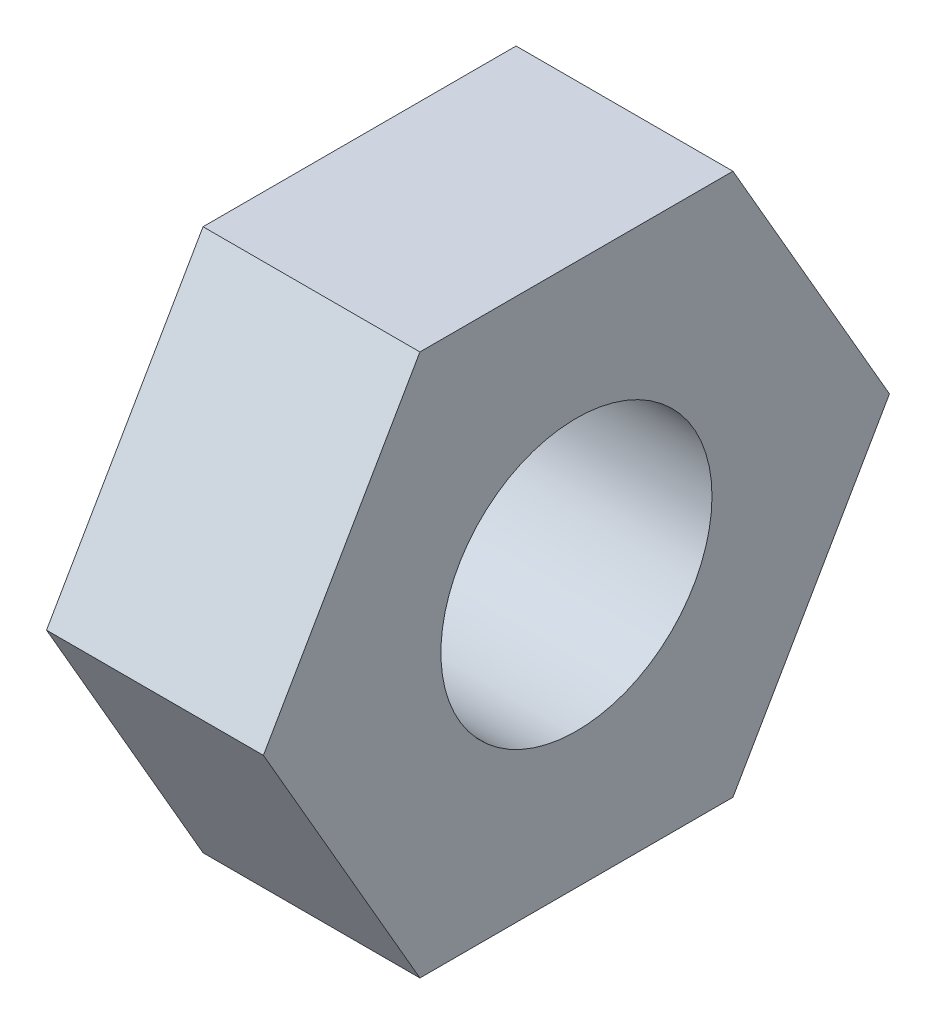
ISO-10303-21;
HEADER;
FILE_DESCRIPTION(('STEP AP214'),'2;1');
FILE_NAME('part.step','',(''),(''),'','','');
FILE_SCHEMA(('AUTOMOTIVE_DESIGN { 1 0 10303 214 1 1 1 1 }'));
ENDSEC;
DATA;
#1=APPLICATION_CONTEXT('core data for automotive mechanical design processes');
#2=APPLICATION_PROTOCOL_DEFINITION('international standard','automotive_design',2000,#1);
#3=PRODUCT_CONTEXT('',#1,'mechanical');
#4=PRODUCT('Part','Part','',(#3));
#5=PRODUCT_RELATED_PRODUCT_CATEGORY('part','',(#4));
#6=PRODUCT_DEFINITION_FORMATION('','',#4);
#7=PRODUCT_DEFINITION_CONTEXT('part definition',#1,'design');
#8=PRODUCT_DEFINITION('design','',#6,#7);
#9=PRODUCT_DEFINITION_SHAPE('','',#8);
#10=(LENGTH_UNIT() NAMED_UNIT(*) SI_UNIT(.MILLI.,.METRE.));
#11=(NAMED_UNIT(*) PLANE_ANGLE_UNIT() SI_UNIT($,.RADIAN.));
#12=(NAMED_UNIT(*) SI_UNIT($,.STERADIAN.) SOLID_ANGLE_UNIT());
#13=UNCERTAINTY_MEASURE_WITH_UNIT(LENGTH_MEASURE(1.E-05),#10,'distance_accuracy_value','');
#14=(GEOMETRIC_REPRESENTATION_CONTEXT(3) GLOBAL_UNCERTAINTY_ASSIGNED_CONTEXT((#13)) GLOBAL_UNIT_ASSIGNED_CONTEXT((#10,
#11,#12)) REPRESENTATION_CONTEXT('',''));
#15=CARTESIAN_POINT('',(0.,0.,0.));
#16=DIRECTION('',(0.,0.,1.));
#17=DIRECTION('',(1.,0.,0.));
#18=AXIS2_PLACEMENT_3D('',#15,#16,#17);
#19=CARTESIAN_POINT('',(1.6,-2.,-1.15470053837925));
#20=DIRECTION('',(0.,0.5,0.866025403784439));
#21=DIRECTION('',(0.,-0.866025403784439,0.5));
#22=AXIS2_PLACEMENT_3D('',#19,#20,#21);
#23=PLANE('',#22);
#24=DIRECTION('',(0.,0.866025403784439,-0.5));
#25=VECTOR('',#24,1.);
#26=CARTESIAN_POINT('',(0.,-2.,-1.15470053837925));
#27=LINE('',#26,#25);
#28=CARTESIAN_POINT('',(0.,-2.,-1.15470053837925));
#29=VERTEX_POINT('',#28);
#30=CARTESIAN_POINT('',(0.,0.,-2.3094010767585));
#31=VERTEX_POINT('',#30);
#32=EDGE_CURVE('E127',#29,#31,#27,.T.);
#33=ORIENTED_EDGE('',*,*,#32,.T.);
#34=DIRECTION('',(-1.,0.,0.));
#35=VECTOR('',#34,1.);
#36=CARTESIAN_POINT('',(1.6,0.,-2.3094010767585));
#37=LINE('',#36,#35);
#38=CARTESIAN_POINT('',(1.6,0.,-2.3094010767585));
#39=VERTEX_POINT('',#38);
#40=EDGE_CURVE('E11',#39,#31,#37,.T.);
#41=ORIENTED_EDGE('',*,*,#40,.F.);
#42=DIRECTION('',(0.,0.866025403784439,-0.5));
#43=VECTOR('',#42,1.);
#44=CARTESIAN_POINT('',(1.6,-2.,-1.15470053837925));
#45=LINE('',#44,#43);
#46=CARTESIAN_POINT('',(1.6,-2.,-1.15470053837925));
#47=VERTEX_POINT('',#46);
#48=EDGE_CURVE('E139',#47,#39,#45,.T.);
#49=ORIENTED_EDGE('',*,*,#48,.F.);
#50=DIRECTION('',(-1.,0.,0.));
#51=VECTOR('',#50,1.);
#52=CARTESIAN_POINT('',(1.6,-2.,-1.15470053837925));
#53=LINE('',#52,#51);
#54=EDGE_CURVE('E124',#47,#29,#53,.T.);
#55=ORIENTED_EDGE('',*,*,#54,.T.);
#56=EDGE_LOOP('',(#33,#41,#49,#55));
#57=FACE_BOUND('',#56,.T.);
#58=ADVANCED_FACE('F41',(#57),#23,.F.);
#59=CARTESIAN_POINT('',(1.6,0.,-2.3094010767585));
#60=DIRECTION('',(0.,-0.5,0.866025403784439));
#61=DIRECTION('',(0.,-0.866025403784439,-0.5));
#62=AXIS2_PLACEMENT_3D('',#59,#60,#61);
#63=PLANE('',#62);
#64=DIRECTION('',(0.,0.866025403784439,0.5));
#65=VECTOR('',#64,1.);
#66=CARTESIAN_POINT('',(0.,0.,-2.3094010767585));
#67=LINE('',#66,#65);
#68=CARTESIAN_POINT('',(0.,2.,-1.15470053837925));
#69=VERTEX_POINT('',#68);
#70=EDGE_CURVE('E129',#31,#69,#67,.T.);
#71=ORIENTED_EDGE('',*,*,#70,.T.);
#72=DIRECTION('',(-1.,0.,0.));
#73=VECTOR('',#72,1.);
#74=CARTESIAN_POINT('',(1.6,2.,-1.15470053837925));
#75=LINE('',#74,#73);
#76=CARTESIAN_POINT('',(1.6,2.,-1.15470053837925));
#77=VERTEX_POINT('',#76);
#78=EDGE_CURVE('E49',#77,#69,#75,.T.);
#79=ORIENTED_EDGE('',*,*,#78,.F.);
#80=DIRECTION('',(0.,0.866025403784439,0.5));
#81=VECTOR('',#80,1.);
#82=CARTESIAN_POINT('',(1.6,0.,-2.3094010767585));
#83=LINE('',#82,#81);
#84=EDGE_CURVE('E92',#39,#77,#83,.T.);
#85=ORIENTED_EDGE('',*,*,#84,.F.);
#86=ORIENTED_EDGE('',*,*,#40,.T.);
#87=EDGE_LOOP('',(#71,#79,#85,#86));
#88=FACE_BOUND('',#87,.T.);
#89=ADVANCED_FACE('F162',(#88),#63,.F.);
#90=CARTESIAN_POINT('',(1.6,2.,-1.15470053837925));
#91=DIRECTION('',(0.,-1.,0.));
#92=DIRECTION('',(0.,0.,-1.));
#93=AXIS2_PLACEMENT_3D('',#90,#91,#92);
#94=PLANE('',#93);
#95=DIRECTION('',(0.,0.,1.));
#96=VECTOR('',#95,1.);
#97=CARTESIAN_POINT('',(0.,2.,-1.15470053837925));
#98=LINE('',#97,#96);
#99=CARTESIAN_POINT('',(0.,2.,1.15470053837925));
#100=VERTEX_POINT('',#99);
#101=EDGE_CURVE('E131',#69,#100,#98,.T.);
#102=ORIENTED_EDGE('',*,*,#101,.T.);
#103=DIRECTION('',(-1.,0.,0.));
#104=VECTOR('',#103,1.);
#105=CARTESIAN_POINT('',(1.6,2.,1.15470053837925));
#106=LINE('',#105,#104);
#107=CARTESIAN_POINT('',(1.6,2.,1.15470053837925));
#108=VERTEX_POINT('',#107);
#109=EDGE_CURVE('E116',#108,#100,#106,.T.);
#110=ORIENTED_EDGE('',*,*,#109,.F.);
#111=DIRECTION('',(0.,0.,1.));
#112=VECTOR('',#111,1.);
#113=CARTESIAN_POINT('',(1.6,2.,-1.15470053837925));
#114=LINE('',#113,#112);
#115=EDGE_CURVE('E107',#77,#108,#114,.T.);
#116=ORIENTED_EDGE('',*,*,#115,.F.);
#117=ORIENTED_EDGE('',*,*,#78,.T.);
#118=EDGE_LOOP('',(#102,#110,#116,#117));
#119=FACE_BOUND('',#118,.T.);
#120=ADVANCED_FACE('F145',(#119),#94,.F.);
#121=CARTESIAN_POINT('',(1.6,2.,1.15470053837925));
#122=DIRECTION('',(0.,-0.5,-0.866025403784438));
#123=DIRECTION('',(0.,0.866025403784439,-0.5));
#124=AXIS2_PLACEMENT_3D('',#121,#122,#123);
#125=PLANE('',#124);
#126=DIRECTION('',(0.,-0.866025403784438,0.5));
#127=VECTOR('',#126,1.);
#128=CARTESIAN_POINT('',(0.,2.,1.15470053837925));
#129=LINE('',#128,#127);
#130=CARTESIAN_POINT('',(0.,0.,2.3094010767585));
#131=VERTEX_POINT('',#130);
#132=EDGE_CURVE('E119',#100,#131,#129,.T.);
#133=ORIENTED_EDGE('',*,*,#132,.T.);
#134=DIRECTION('',(-1.,0.,0.));
#135=VECTOR('',#134,1.);
#136=CARTESIAN_POINT('',(1.6,0.,2.3094010767585));
#137=LINE('',#136,#135);
#138=CARTESIAN_POINT('',(1.6,0.,2.3094010767585));
#139=VERTEX_POINT('',#138);
#140=EDGE_CURVE('E114',#139,#131,#137,.T.);
#141=ORIENTED_EDGE('',*,*,#140,.F.);
#142=DIRECTION('',(0.,-0.866025403784438,0.5));
#143=VECTOR('',#142,1.);
#144=CARTESIAN_POINT('',(1.6,2.,1.15470053837925));
#145=LINE('',#144,#143);
#146=EDGE_CURVE('E105',#108,#139,#145,.T.);
#147=ORIENTED_EDGE('',*,*,#146,.F.);
#148=ORIENTED_EDGE('',*,*,#109,.T.);
#149=EDGE_LOOP('',(#133,#141,#147,#148));
#150=FACE_BOUND('',#149,.T.);
#151=ADVANCED_FACE('F111',(#150),#125,.F.);
#152=CARTESIAN_POINT('',(1.6,0.,2.3094010767585));
#153=DIRECTION('',(0.,0.5,-0.866025403784439));
#154=DIRECTION('',(0.,0.866025403784439,0.5));
#155=AXIS2_PLACEMENT_3D('',#152,#153,#154);
#156=PLANE('',#155);
#157=DIRECTION('',(0.,-0.866025403784439,-0.5));
#158=VECTOR('',#157,1.);
#159=CARTESIAN_POINT('',(0.,0.,2.3094010767585));
#160=LINE('',#159,#158);
#161=CARTESIAN_POINT('',(0.,-2.,1.15470053837925));
#162=VERTEX_POINT('',#161);
#163=EDGE_CURVE('E83',#131,#162,#160,.T.);
#164=ORIENTED_EDGE('',*,*,#163,.T.);
#165=DIRECTION('',(-1.,0.,0.));
#166=VECTOR('',#165,1.);
#167=CARTESIAN_POINT('',(1.6,-2.,1.15470053837925));
#168=LINE('',#167,#166);
#169=CARTESIAN_POINT('',(1.6,-2.,1.15470053837925));
#170=VERTEX_POINT('',#169);
#171=EDGE_CURVE('E120',#170,#162,#168,.T.);
#172=ORIENTED_EDGE('',*,*,#171,.F.);
#173=DIRECTION('',(0.,-0.866025403784439,-0.5));
#174=VECTOR('',#173,1.);
#175=CARTESIAN_POINT('',(1.6,0.,2.3094010767585));
#176=LINE('',#175,#174);
#177=EDGE_CURVE('E106',#139,#170,#176,.T.);
#178=ORIENTED_EDGE('',*,*,#177,.F.);
#179=ORIENTED_EDGE('',*,*,#140,.T.);
#180=EDGE_LOOP('',(#164,#172,#178,#179));
#181=FACE_BOUND('',#180,.T.);
#182=ADVANCED_FACE('F117',(#181),#156,.F.);
#183=CARTESIAN_POINT('',(1.6,-2.,1.15470053837925));
#184=DIRECTION('',(0.,1.,0.));
#185=DIRECTION('',(0.,0.,1.));
#186=AXIS2_PLACEMENT_3D('',#183,#184,#185);
#187=PLANE('',#186);
#188=DIRECTION('',(0.,0.,-1.));
#189=VECTOR('',#188,1.);
#190=CARTESIAN_POINT('',(0.,-2.,1.15470053837925));
#191=LINE('',#190,#189);
#192=EDGE_CURVE('E87',#162,#29,#191,.T.);
#193=ORIENTED_EDGE('',*,*,#192,.T.);
#194=ORIENTED_EDGE('',*,*,#54,.F.);
#195=DIRECTION('',(0.,0.,-1.));
#196=VECTOR('',#195,1.);
#197=CARTESIAN_POINT('',(1.6,-2.,1.15470053837925));
#198=LINE('',#197,#196);
#199=EDGE_CURVE('E59',#170,#47,#198,.T.);
#200=ORIENTED_EDGE('',*,*,#199,.F.);
#201=ORIENTED_EDGE('',*,*,#171,.T.);
#202=EDGE_LOOP('',(#193,#194,#200,#201));
#203=FACE_BOUND('',#202,.T.);
#204=ADVANCED_FACE('F151',(#203),#187,.F.);
#205=CARTESIAN_POINT('',(1.6,0.,0.));
#206=DIRECTION('',(1.,0.,0.));
#207=DIRECTION('',(0.,0.,-1.));
#208=AXIS2_PLACEMENT_3D('',#205,#206,#207);
#209=PLANE('',#208);
#210=CARTESIAN_POINT('',(1.60000000000005,0.,0.));
#211=DIRECTION('',(1.,0.,0.));
#212=DIRECTION('',(0.,0.,-1.));
#213=AXIS2_PLACEMENT_3D('',#210,#211,#212);
#214=CIRCLE('',#213,1.);
#215=CARTESIAN_POINT('',(1.60000000000005,0.,-1.));
#216=VERTEX_POINT('',#215);
#217=EDGE_CURVE('E128',#216,#216,#214,.F.);
#218=ORIENTED_EDGE('',*,*,#217,.T.);
#219=EDGE_LOOP('',(#218));
#220=FACE_BOUND('',#219,.T.);
#221=ORIENTED_EDGE('',*,*,#48,.T.);
#222=ORIENTED_EDGE('',*,*,#84,.T.);
#223=ORIENTED_EDGE('',*,*,#115,.T.);
#224=ORIENTED_EDGE('',*,*,#146,.T.);
#225=ORIENTED_EDGE('',*,*,#177,.T.);
#226=ORIENTED_EDGE('',*,*,#199,.T.);
#227=EDGE_LOOP('',(#221,#222,#223,#224,#225,#226));
#228=FACE_BOUND('',#227,.T.);
#229=ADVANCED_FACE('F102',(#220,#228),#209,.T.);
#230=CARTESIAN_POINT('',(0.,0.,0.));
#231=DIRECTION('',(1.,0.,0.));
#232=DIRECTION('',(0.,0.,-1.));
#233=AXIS2_PLACEMENT_3D('',#230,#231,#232);
#234=PLANE('',#233);
#235=CARTESIAN_POINT('',(0.,0.,0.));
#236=DIRECTION('',(1.,0.,0.));
#237=DIRECTION('',(0.,0.,-1.));
#238=AXIS2_PLACEMENT_3D('',#235,#236,#237);
#239=CIRCLE('',#238,1.);
#240=CARTESIAN_POINT('',(0.,0.,-1.));
#241=VERTEX_POINT('',#240);
#242=EDGE_CURVE('E42',#241,#241,#239,.F.);
#243=ORIENTED_EDGE('',*,*,#242,.F.);
#244=EDGE_LOOP('',(#243));
#245=FACE_BOUND('',#244,.T.);
#246=ORIENTED_EDGE('',*,*,#32,.F.);
#247=ORIENTED_EDGE('',*,*,#192,.F.);
#248=ORIENTED_EDGE('',*,*,#163,.F.);
#249=ORIENTED_EDGE('',*,*,#132,.F.);
#250=ORIENTED_EDGE('',*,*,#101,.F.);
#251=ORIENTED_EDGE('',*,*,#70,.F.);
#252=EDGE_LOOP('',(#246,#247,#248,#249,#250,#251));
#253=FACE_BOUND('',#252,.T.);
#254=ADVANCED_FACE('F150',(#245,#253),#234,.F.);
#255=CARTESIAN_POINT('',(-1000.,0.,0.));
#256=DIRECTION('',(-1.,0.,0.));
#257=DIRECTION('',(0.,0.,1.));
#258=AXIS2_PLACEMENT_3D('',#255,#256,#257);
#259=CYLINDRICAL_SURFACE('',#258,1.);
#260=ORIENTED_EDGE('',*,*,#217,.F.);
#261=EDGE_LOOP('',(#260));
#262=FACE_BOUND('',#261,.T.);
#263=ORIENTED_EDGE('',*,*,#242,.T.);
#264=EDGE_LOOP('',(#263));
#265=FACE_BOUND('',#264,.T.);
#266=ADVANCED_FACE('F205',(#262,#265),#259,.F.);
#267=CLOSED_SHELL('',(#58,#89,#120,#151,#182,#204,#229,#254,#266));
#268=MANIFOLD_SOLID_BREP('B2',#267);
#269=ADVANCED_BREP_SHAPE_REPRESENTATION('',(#18,#268),#14);
#270=SHAPE_DEFINITION_REPRESENTATION(#9,#269);
ENDSEC;
END-ISO-10303-21;
